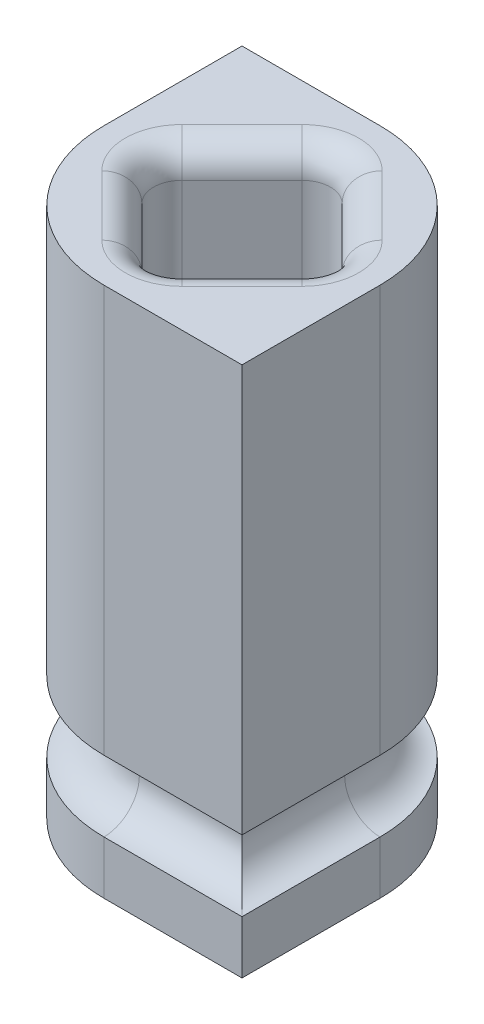
ISO-10303-21;
HEADER;
FILE_DESCRIPTION(('STEP AP214'),'2;1');
FILE_NAME('part.step','',(''),(''),'','','');
FILE_SCHEMA(('AUTOMOTIVE_DESIGN { 1 0 10303 214 1 1 1 1 }'));
ENDSEC;
DATA;
#1=APPLICATION_CONTEXT('core data for automotive mechanical design processes');
#2=APPLICATION_PROTOCOL_DEFINITION('international standard','automotive_design',2000,#1);
#3=PRODUCT_CONTEXT('',#1,'mechanical');
#4=PRODUCT('Part','Part','',(#3));
#5=PRODUCT_RELATED_PRODUCT_CATEGORY('part','',(#4));
#6=PRODUCT_DEFINITION_FORMATION('','',#4);
#7=PRODUCT_DEFINITION_CONTEXT('part definition',#1,'design');
#8=PRODUCT_DEFINITION('design','',#6,#7);
#9=PRODUCT_DEFINITION_SHAPE('','',#8);
#10=(LENGTH_UNIT() NAMED_UNIT(*) SI_UNIT(.MILLI.,.METRE.));
#11=(NAMED_UNIT(*) PLANE_ANGLE_UNIT() SI_UNIT($,.RADIAN.));
#12=(NAMED_UNIT(*) SI_UNIT($,.STERADIAN.) SOLID_ANGLE_UNIT());
#13=UNCERTAINTY_MEASURE_WITH_UNIT(LENGTH_MEASURE(1.E-05),#10,'distance_accuracy_value','');
#14=(GEOMETRIC_REPRESENTATION_CONTEXT(3) GLOBAL_UNCERTAINTY_ASSIGNED_CONTEXT((#13)) GLOBAL_UNIT_ASSIGNED_CONTEXT((#10,
#11,#12)) REPRESENTATION_CONTEXT('',''));
#15=CARTESIAN_POINT('',(0.,0.,0.));
#16=DIRECTION('',(0.,0.,1.));
#17=DIRECTION('',(1.,0.,0.));
#18=AXIS2_PLACEMENT_3D('',#15,#16,#17);
#19=CARTESIAN_POINT('',(3.9,5.,0.));
#20=DIRECTION('',(-1.,0.,0.));
#21=DIRECTION('',(0.,0.,1.));
#22=AXIS2_PLACEMENT_3D('',#19,#20,#21);
#23=PLANE('',#22);
#24=DIRECTION('',(0.,-1.,0.));
#25=VECTOR('',#24,1.);
#26=CARTESIAN_POINT('',(3.9,5.,3.9));
#27=LINE('',#26,#25);
#28=CARTESIAN_POINT('',(3.9,15.,3.9));
#29=VERTEX_POINT('',#28);
#30=CARTESIAN_POINT('',(3.9,3.5,3.9));
#31=VERTEX_POINT('',#30);
#32=EDGE_CURVE('E318',#29,#31,#27,.T.);
#33=ORIENTED_EDGE('',*,*,#32,.T.);
#34=DIRECTION('',(0.,0.,-1.));
#35=VECTOR('',#34,1.);
#36=CARTESIAN_POINT('',(3.9,3.5,0.));
#37=LINE('',#36,#35);
#38=CARTESIAN_POINT('',(3.9,3.5,0.));
#39=VERTEX_POINT('',#38);
#40=EDGE_CURVE('E290',#31,#39,#37,.T.);
#41=ORIENTED_EDGE('',*,*,#40,.T.);
#42=DIRECTION('',(0.,-1.,0.));
#43=VECTOR('',#42,1.);
#44=CARTESIAN_POINT('',(3.9,5.,0.));
#45=LINE('',#44,#43);
#46=CARTESIAN_POINT('',(3.9,15.,0.));
#47=VERTEX_POINT('',#46);
#48=EDGE_CURVE('E338',#47,#39,#45,.T.);
#49=ORIENTED_EDGE('',*,*,#48,.F.);
#50=DIRECTION('',(0.,0.,-1.));
#51=VECTOR('',#50,1.);
#52=CARTESIAN_POINT('',(3.9,15.,0.));
#53=LINE('',#52,#51);
#54=EDGE_CURVE('E263',#29,#47,#53,.T.);
#55=ORIENTED_EDGE('',*,*,#54,.F.);
#56=EDGE_LOOP('',(#33,#41,#49,#55));
#57=FACE_BOUND('',#56,.T.);
#58=ADVANCED_FACE('F33',(#57),#23,.F.);
#59=CARTESIAN_POINT('',(0.,5.,0.));
#60=DIRECTION('',(0.,-1.,0.));
#61=DIRECTION('',(0.,0.,-1.));
#62=AXIS2_PLACEMENT_3D('',#59,#60,#61);
#63=CYLINDRICAL_SURFACE('',#62,3.9);
#64=ORIENTED_EDGE('',*,*,#48,.T.);
#65=CARTESIAN_POINT('',(0.,3.5,0.));
#66=DIRECTION('',(0.,1.,0.));
#67=DIRECTION('',(0.,0.,1.));
#68=AXIS2_PLACEMENT_3D('',#65,#66,#67);
#69=CIRCLE('',#68,3.9);
#70=CARTESIAN_POINT('',(0.,3.5,-3.9));
#71=VERTEX_POINT('',#70);
#72=EDGE_CURVE('E293',#39,#71,#69,.T.);
#73=ORIENTED_EDGE('',*,*,#72,.T.);
#74=DIRECTION('',(0.,-1.,0.));
#75=VECTOR('',#74,1.);
#76=CARTESIAN_POINT('',(0.,5.,-3.9));
#77=LINE('',#76,#75);
#78=CARTESIAN_POINT('',(0.,15.,-3.9));
#79=VERTEX_POINT('',#78);
#80=EDGE_CURVE('E334',#79,#71,#77,.T.);
#81=ORIENTED_EDGE('',*,*,#80,.F.);
#82=CARTESIAN_POINT('',(0.,15.,0.));
#83=DIRECTION('',(0.,1.,0.));
#84=DIRECTION('',(0.,0.,1.));
#85=AXIS2_PLACEMENT_3D('',#82,#83,#84);
#86=CIRCLE('',#85,3.9);
#87=EDGE_CURVE('E248',#47,#79,#86,.T.);
#88=ORIENTED_EDGE('',*,*,#87,.F.);
#89=EDGE_LOOP('',(#64,#73,#81,#88));
#90=FACE_BOUND('',#89,.T.);
#91=ADVANCED_FACE('F519',(#90),#63,.T.);
#92=CARTESIAN_POINT('',(-3.9,5.,-3.9));
#93=DIRECTION('',(0.,0.,1.));
#94=DIRECTION('',(1.,0.,0.));
#95=AXIS2_PLACEMENT_3D('',#92,#93,#94);
#96=PLANE('',#95);
#97=ORIENTED_EDGE('',*,*,#80,.T.);
#98=DIRECTION('',(-1.,0.,0.));
#99=VECTOR('',#98,1.);
#100=CARTESIAN_POINT('',(-3.9,3.5,-3.9));
#101=LINE('',#100,#99);
#102=CARTESIAN_POINT('',(-3.9,3.5,-3.9));
#103=VERTEX_POINT('',#102);
#104=EDGE_CURVE('E295',#71,#103,#101,.T.);
#105=ORIENTED_EDGE('',*,*,#104,.T.);
#106=DIRECTION('',(0.,-1.,0.));
#107=VECTOR('',#106,1.);
#108=CARTESIAN_POINT('',(-3.9,5.,-3.9));
#109=LINE('',#108,#107);
#110=CARTESIAN_POINT('',(-3.9,15.,-3.9));
#111=VERTEX_POINT('',#110);
#112=EDGE_CURVE('E330',#111,#103,#109,.T.);
#113=ORIENTED_EDGE('',*,*,#112,.F.);
#114=DIRECTION('',(-1.,0.,0.));
#115=VECTOR('',#114,1.);
#116=CARTESIAN_POINT('',(0.,15.,-3.9));
#117=LINE('',#116,#115);
#118=EDGE_CURVE('E251',#79,#111,#117,.T.);
#119=ORIENTED_EDGE('',*,*,#118,.F.);
#120=EDGE_LOOP('',(#97,#105,#113,#119));
#121=FACE_BOUND('',#120,.T.);
#122=ADVANCED_FACE('F526',(#121),#96,.F.);
#123=CARTESIAN_POINT('',(-3.9,5.,-3.9));
#124=DIRECTION('',(1.,0.,0.));
#125=DIRECTION('',(0.,0.,-1.));
#126=AXIS2_PLACEMENT_3D('',#123,#124,#125);
#127=PLANE('',#126);
#128=ORIENTED_EDGE('',*,*,#112,.T.);
#129=DIRECTION('',(0.,0.,1.));
#130=VECTOR('',#129,1.);
#131=CARTESIAN_POINT('',(-3.9,3.5,0.));
#132=LINE('',#131,#130);
#133=CARTESIAN_POINT('',(-3.9,3.5,0.));
#134=VERTEX_POINT('',#133);
#135=EDGE_CURVE('E297',#103,#134,#132,.T.);
#136=ORIENTED_EDGE('',*,*,#135,.T.);
#137=DIRECTION('',(0.,-1.,0.));
#138=VECTOR('',#137,1.);
#139=CARTESIAN_POINT('',(-3.9,5.,0.));
#140=LINE('',#139,#138);
#141=CARTESIAN_POINT('',(-3.9,15.,0.));
#142=VERTEX_POINT('',#141);
#143=EDGE_CURVE('E326',#142,#134,#140,.T.);
#144=ORIENTED_EDGE('',*,*,#143,.F.);
#145=DIRECTION('',(0.,0.,1.));
#146=VECTOR('',#145,1.);
#147=CARTESIAN_POINT('',(-3.9,15.,-3.9));
#148=LINE('',#147,#146);
#149=EDGE_CURVE('E254',#111,#142,#148,.T.);
#150=ORIENTED_EDGE('',*,*,#149,.F.);
#151=EDGE_LOOP('',(#128,#136,#144,#150));
#152=FACE_BOUND('',#151,.T.);
#153=ADVANCED_FACE('F607',(#152),#127,.F.);
#154=CARTESIAN_POINT('',(0.,5.,0.));
#155=DIRECTION('',(0.,-1.,0.));
#156=DIRECTION('',(0.,0.,-1.));
#157=AXIS2_PLACEMENT_3D('',#154,#155,#156);
#158=CYLINDRICAL_SURFACE('',#157,3.9);
#159=ORIENTED_EDGE('',*,*,#143,.T.);
#160=CARTESIAN_POINT('',(0.,3.5,0.));
#161=DIRECTION('',(0.,1.,0.));
#162=DIRECTION('',(0.,0.,1.));
#163=AXIS2_PLACEMENT_3D('',#160,#161,#162);
#164=CIRCLE('',#163,3.9);
#165=CARTESIAN_POINT('',(0.,3.5,3.9));
#166=VERTEX_POINT('',#165);
#167=EDGE_CURVE('E286',#134,#166,#164,.T.);
#168=ORIENTED_EDGE('',*,*,#167,.T.);
#169=DIRECTION('',(0.,-1.,0.));
#170=VECTOR('',#169,1.);
#171=CARTESIAN_POINT('',(0.,5.,3.9));
#172=LINE('',#171,#170);
#173=CARTESIAN_POINT('',(0.,15.,3.9));
#174=VERTEX_POINT('',#173);
#175=EDGE_CURVE('E322',#174,#166,#172,.T.);
#176=ORIENTED_EDGE('',*,*,#175,.F.);
#177=CARTESIAN_POINT('',(0.,15.,0.));
#178=DIRECTION('',(0.,1.,0.));
#179=DIRECTION('',(0.,0.,1.));
#180=AXIS2_PLACEMENT_3D('',#177,#178,#179);
#181=CIRCLE('',#180,3.9);
#182=EDGE_CURVE('E257',#142,#174,#181,.T.);
#183=ORIENTED_EDGE('',*,*,#182,.F.);
#184=EDGE_LOOP('',(#159,#168,#176,#183));
#185=FACE_BOUND('',#184,.T.);
#186=ADVANCED_FACE('F601',(#185),#158,.T.);
#187=CARTESIAN_POINT('',(0.,5.,3.9));
#188=DIRECTION('',(0.,0.,-1.));
#189=DIRECTION('',(-1.,0.,0.));
#190=AXIS2_PLACEMENT_3D('',#187,#188,#189);
#191=PLANE('',#190);
#192=ORIENTED_EDGE('',*,*,#175,.T.);
#193=DIRECTION('',(1.,0.,0.));
#194=VECTOR('',#193,1.);
#195=CARTESIAN_POINT('',(3.9,3.5,3.9));
#196=LINE('',#195,#194);
#197=EDGE_CURVE('E288',#166,#31,#196,.T.);
#198=ORIENTED_EDGE('',*,*,#197,.T.);
#199=ORIENTED_EDGE('',*,*,#32,.F.);
#200=DIRECTION('',(1.,0.,0.));
#201=VECTOR('',#200,1.);
#202=CARTESIAN_POINT('',(3.9,15.,3.9));
#203=LINE('',#202,#201);
#204=EDGE_CURVE('E260',#174,#29,#203,.T.);
#205=ORIENTED_EDGE('',*,*,#204,.F.);
#206=EDGE_LOOP('',(#192,#198,#199,#205));
#207=FACE_BOUND('',#206,.T.);
#208=ADVANCED_FACE('F609',(#207),#191,.F.);
#209=CARTESIAN_POINT('',(0.,0.,0.));
#210=DIRECTION('',(0.,1.,0.));
#211=DIRECTION('',(0.,0.,1.));
#212=AXIS2_PLACEMENT_3D('',#209,#210,#211);
#213=PLANE('',#212);
#214=DIRECTION('',(0.,0.,-1.));
#215=VECTOR('',#214,1.);
#216=CARTESIAN_POINT('',(3.9,0.,0.));
#217=LINE('',#216,#215);
#218=CARTESIAN_POINT('',(3.9,0.,3.9));
#219=VERTEX_POINT('',#218);
#220=CARTESIAN_POINT('',(3.9,0.,0.));
#221=VERTEX_POINT('',#220);
#222=EDGE_CURVE('E299',#219,#221,#217,.T.);
#223=ORIENTED_EDGE('',*,*,#222,.F.);
#224=DIRECTION('',(1.,0.,0.));
#225=VECTOR('',#224,1.);
#226=CARTESIAN_POINT('',(0.,0.,3.9));
#227=LINE('',#226,#225);
#228=CARTESIAN_POINT('',(0.,0.,3.9));
#229=VERTEX_POINT('',#228);
#230=EDGE_CURVE('E314',#229,#219,#227,.T.);
#231=ORIENTED_EDGE('',*,*,#230,.F.);
#232=CARTESIAN_POINT('',(0.,0.,0.));
#233=DIRECTION('',(0.,1.,0.));
#234=DIRECTION('',(0.,0.,1.));
#235=AXIS2_PLACEMENT_3D('',#232,#233,#234);
#236=CIRCLE('',#235,3.9);
#237=CARTESIAN_POINT('',(-3.9,0.,0.));
#238=VERTEX_POINT('',#237);
#239=EDGE_CURVE('E311',#238,#229,#236,.T.);
#240=ORIENTED_EDGE('',*,*,#239,.F.);
#241=DIRECTION('',(0.,0.,1.));
#242=VECTOR('',#241,1.);
#243=CARTESIAN_POINT('',(-3.9,0.,-3.9));
#244=LINE('',#243,#242);
#245=CARTESIAN_POINT('',(-3.9,0.,-3.9));
#246=VERTEX_POINT('',#245);
#247=EDGE_CURVE('E308',#246,#238,#244,.T.);
#248=ORIENTED_EDGE('',*,*,#247,.F.);
#249=DIRECTION('',(-1.,0.,0.));
#250=VECTOR('',#249,1.);
#251=CARTESIAN_POINT('',(-3.9,0.,-3.9));
#252=LINE('',#251,#250);
#253=CARTESIAN_POINT('',(0.,0.,-3.9));
#254=VERTEX_POINT('',#253);
#255=EDGE_CURVE('E305',#254,#246,#252,.T.);
#256=ORIENTED_EDGE('',*,*,#255,.F.);
#257=CARTESIAN_POINT('',(0.,0.,0.));
#258=DIRECTION('',(0.,1.,0.));
#259=DIRECTION('',(0.,0.,1.));
#260=AXIS2_PLACEMENT_3D('',#257,#258,#259);
#261=CIRCLE('',#260,3.9);
#262=EDGE_CURVE('E302',#221,#254,#261,.T.);
#263=ORIENTED_EDGE('',*,*,#262,.F.);
#264=EDGE_LOOP('',(#223,#231,#240,#248,#256,#263));
#265=FACE_BOUND('',#264,.T.);
#266=ADVANCED_FACE('F556',(#265),#213,.F.);
#267=DIRECTION('',(1.,0.,0.));
#268=VECTOR('',#267,1.);
#269=CARTESIAN_POINT('',(3.9,1.5,3.9));
#270=LINE('',#269,#268);
#271=CARTESIAN_POINT('',(0.,1.5,3.9));
#272=VERTEX_POINT('',#271);
#273=CARTESIAN_POINT('',(3.9,1.5,3.9));
#274=VERTEX_POINT('',#273);
#275=EDGE_CURVE('E270',#272,#274,#270,.T.);
#276=ORIENTED_EDGE('',*,*,#275,.F.);
#277=EDGE_CURVE('E321',#272,#229,#172,.T.);
#278=ORIENTED_EDGE('',*,*,#277,.T.);
#279=ORIENTED_EDGE('',*,*,#230,.T.);
#280=EDGE_CURVE('E317',#274,#219,#27,.T.);
#281=ORIENTED_EDGE('',*,*,#280,.F.);
#282=EDGE_LOOP('',(#276,#278,#279,#281));
#283=FACE_BOUND('',#282,.T.);
#284=ADVANCED_FACE('F549',(#283),#191,.F.);
#285=CARTESIAN_POINT('',(0.,1.5,0.));
#286=DIRECTION('',(0.,1.,0.));
#287=DIRECTION('',(0.,0.,1.));
#288=AXIS2_PLACEMENT_3D('',#285,#286,#287);
#289=CIRCLE('',#288,3.9);
#290=CARTESIAN_POINT('',(-3.9,1.5,0.));
#291=VERTEX_POINT('',#290);
#292=EDGE_CURVE('E267',#291,#272,#289,.T.);
#293=ORIENTED_EDGE('',*,*,#292,.F.);
#294=EDGE_CURVE('E325',#291,#238,#140,.T.);
#295=ORIENTED_EDGE('',*,*,#294,.T.);
#296=ORIENTED_EDGE('',*,*,#239,.T.);
#297=ORIENTED_EDGE('',*,*,#277,.F.);
#298=EDGE_LOOP('',(#293,#295,#296,#297));
#299=FACE_BOUND('',#298,.T.);
#300=ADVANCED_FACE('F598',(#299),#158,.T.);
#301=DIRECTION('',(0.,0.,1.));
#302=VECTOR('',#301,1.);
#303=CARTESIAN_POINT('',(-3.9,1.5,0.));
#304=LINE('',#303,#302);
#305=CARTESIAN_POINT('',(-3.9,1.5,-3.9));
#306=VERTEX_POINT('',#305);
#307=EDGE_CURVE('E283',#306,#291,#304,.T.);
#308=ORIENTED_EDGE('',*,*,#307,.F.);
#309=EDGE_CURVE('E329',#306,#246,#109,.T.);
#310=ORIENTED_EDGE('',*,*,#309,.T.);
#311=ORIENTED_EDGE('',*,*,#247,.T.);
#312=ORIENTED_EDGE('',*,*,#294,.F.);
#313=EDGE_LOOP('',(#308,#310,#311,#312));
#314=FACE_BOUND('',#313,.T.);
#315=ADVANCED_FACE('F595',(#314),#127,.F.);
#316=DIRECTION('',(-1.,0.,0.));
#317=VECTOR('',#316,1.);
#318=CARTESIAN_POINT('',(-3.9,1.5,-3.9));
#319=LINE('',#318,#317);
#320=CARTESIAN_POINT('',(0.,1.5,-3.9));
#321=VERTEX_POINT('',#320);
#322=EDGE_CURVE('E280',#321,#306,#319,.T.);
#323=ORIENTED_EDGE('',*,*,#322,.F.);
#324=EDGE_CURVE('E333',#321,#254,#77,.T.);
#325=ORIENTED_EDGE('',*,*,#324,.T.);
#326=ORIENTED_EDGE('',*,*,#255,.T.);
#327=ORIENTED_EDGE('',*,*,#309,.F.);
#328=EDGE_LOOP('',(#323,#325,#326,#327));
#329=FACE_BOUND('',#328,.T.);
#330=ADVANCED_FACE('F541',(#329),#96,.F.);
#331=CARTESIAN_POINT('',(0.,1.5,0.));
#332=DIRECTION('',(0.,1.,0.));
#333=DIRECTION('',(0.,0.,1.));
#334=AXIS2_PLACEMENT_3D('',#331,#332,#333);
#335=CIRCLE('',#334,3.9);
#336=CARTESIAN_POINT('',(3.9,1.5,0.));
#337=VERTEX_POINT('',#336);
#338=EDGE_CURVE('E277',#337,#321,#335,.T.);
#339=ORIENTED_EDGE('',*,*,#338,.F.);
#340=EDGE_CURVE('E337',#337,#221,#45,.T.);
#341=ORIENTED_EDGE('',*,*,#340,.T.);
#342=ORIENTED_EDGE('',*,*,#262,.T.);
#343=ORIENTED_EDGE('',*,*,#324,.F.);
#344=EDGE_LOOP('',(#339,#341,#342,#343));
#345=FACE_BOUND('',#344,.T.);
#346=ADVANCED_FACE('F529',(#345),#63,.T.);
#347=DIRECTION('',(0.,0.,-1.));
#348=VECTOR('',#347,1.);
#349=CARTESIAN_POINT('',(3.9,1.5,0.));
#350=LINE('',#349,#348);
#351=EDGE_CURVE('E274',#274,#337,#350,.T.);
#352=ORIENTED_EDGE('',*,*,#351,.F.);
#353=ORIENTED_EDGE('',*,*,#280,.T.);
#354=ORIENTED_EDGE('',*,*,#222,.T.);
#355=ORIENTED_EDGE('',*,*,#340,.F.);
#356=EDGE_LOOP('',(#352,#353,#354,#355));
#357=FACE_BOUND('',#356,.T.);
#358=ADVANCED_FACE('F522',(#357),#23,.F.);
#359=CARTESIAN_POINT('',(-3.9,2.5,0.));
#360=DIRECTION('',(0.,0.,1.));
#361=DIRECTION('',(1.,0.,0.));
#362=AXIS2_PLACEMENT_3D('',#359,#360,#361);
#363=CYLINDRICAL_SURFACE('',#362,1.);
#364=CARTESIAN_POINT('',(-3.9,2.5,-3.9));
#365=DIRECTION('',(-0.707106781186547,0.,0.707106781186547));
#366=DIRECTION('',(-0.707106781186547,0.,-0.707106781186547));
#367=AXIS2_PLACEMENT_3D('',#364,#365,#366);
#368=ELLIPSE('',#367,1.41421356237309,1.);
#369=CARTESIAN_POINT('',(-2.9,2.5,-2.9));
#370=VERTEX_POINT('',#369);
#371=EDGE_CURVE('E383',#306,#370,#368,.T.);
#372=ORIENTED_EDGE('',*,*,#371,.F.);
#373=ORIENTED_EDGE('',*,*,#307,.T.);
#374=CARTESIAN_POINT('',(-3.9,2.5,0.));
#375=DIRECTION('',(0.,0.,-1.));
#376=DIRECTION('',(-1.,0.,0.));
#377=AXIS2_PLACEMENT_3D('',#374,#375,#376);
#378=CIRCLE('',#377,1.);
#379=CARTESIAN_POINT('',(-2.9,2.5,0.));
#380=VERTEX_POINT('',#379);
#381=EDGE_CURVE('E271',#380,#291,#378,.T.);
#382=ORIENTED_EDGE('',*,*,#381,.F.);
#383=DIRECTION('',(0.,0.,1.));
#384=VECTOR('',#383,1.);
#385=CARTESIAN_POINT('',(-2.9,2.5,0.));
#386=LINE('',#385,#384);
#387=EDGE_CURVE('E386',#370,#380,#386,.T.);
#388=ORIENTED_EDGE('',*,*,#387,.F.);
#389=EDGE_LOOP('',(#372,#373,#382,#388));
#390=FACE_BOUND('',#389,.T.);
#391=ADVANCED_FACE('F532',(#390),#363,.F.);
#392=CARTESIAN_POINT('',(0.,2.5,0.));
#393=DIRECTION('',(0.,1.,0.));
#394=DIRECTION('',(0.,0.,1.));
#395=AXIS2_PLACEMENT_3D('',#392,#393,#394);
#396=TOROIDAL_SURFACE('',#395,3.9,1.);
#397=ORIENTED_EDGE('',*,*,#381,.T.);
#398=ORIENTED_EDGE('',*,*,#292,.T.);
#399=CARTESIAN_POINT('',(0.,2.5,3.9));
#400=DIRECTION('',(-1.,0.,0.));
#401=DIRECTION('',(0.,0.,1.));
#402=AXIS2_PLACEMENT_3D('',#399,#400,#401);
#403=CIRCLE('',#402,1.);
#404=CARTESIAN_POINT('',(0.,2.5,2.9));
#405=VERTEX_POINT('',#404);
#406=EDGE_CURVE('E380',#405,#272,#403,.T.);
#407=ORIENTED_EDGE('',*,*,#406,.F.);
#408=CARTESIAN_POINT('',(0.,2.5,0.));
#409=DIRECTION('',(0.,1.,0.));
#410=DIRECTION('',(0.,0.,1.));
#411=AXIS2_PLACEMENT_3D('',#408,#409,#410);
#412=CIRCLE('',#411,2.9);
#413=EDGE_CURVE('E377',#380,#405,#412,.T.);
#414=ORIENTED_EDGE('',*,*,#413,.F.);
#415=EDGE_LOOP('',(#397,#398,#407,#414));
#416=FACE_BOUND('',#415,.T.);
#417=ADVANCED_FACE('F538',(#416),#396,.F.);
#418=CARTESIAN_POINT('',(-3.9,2.5,0.));
#419=DIRECTION('',(0.,0.,-1.));
#420=DIRECTION('',(-1.,0.,0.));
#421=AXIS2_PLACEMENT_3D('',#418,#419,#420);
#422=CYLINDRICAL_SURFACE('',#421,1.);
#423=CARTESIAN_POINT('',(-3.9,2.5,-3.9));
#424=DIRECTION('',(0.707106781186547,0.,-0.707106781186547));
#425=DIRECTION('',(-0.707106781186547,0.,-0.707106781186547));
#426=AXIS2_PLACEMENT_3D('',#423,#424,#425);
#427=ELLIPSE('',#426,1.41421356237309,1.);
#428=EDGE_CURVE('E371',#370,#103,#427,.F.);
#429=ORIENTED_EDGE('',*,*,#428,.F.);
#430=ORIENTED_EDGE('',*,*,#387,.T.);
#431=CARTESIAN_POINT('',(-3.9,2.5,0.));
#432=DIRECTION('',(0.,0.,-1.));
#433=DIRECTION('',(-1.,0.,0.));
#434=AXIS2_PLACEMENT_3D('',#431,#432,#433);
#435=CIRCLE('',#434,1.);
#436=EDGE_CURVE('E374',#134,#380,#435,.T.);
#437=ORIENTED_EDGE('',*,*,#436,.F.);
#438=ORIENTED_EDGE('',*,*,#135,.F.);
#439=EDGE_LOOP('',(#429,#430,#437,#438));
#440=FACE_BOUND('',#439,.T.);
#441=ADVANCED_FACE('F588',(#440),#422,.F.);
#442=CARTESIAN_POINT('',(-2.9,2.5,-3.9));
#443=DIRECTION('',(-1.,0.,0.));
#444=DIRECTION('',(0.,0.,1.));
#445=AXIS2_PLACEMENT_3D('',#442,#443,#444);
#446=CYLINDRICAL_SURFACE('',#445,1.);
#447=ORIENTED_EDGE('',*,*,#322,.T.);
#448=ORIENTED_EDGE('',*,*,#371,.T.);
#449=DIRECTION('',(-1.,0.,0.));
#450=VECTOR('',#449,1.);
#451=CARTESIAN_POINT('',(-2.9,2.5,-2.9));
#452=LINE('',#451,#450);
#453=CARTESIAN_POINT('',(0.,2.5,-2.9));
#454=VERTEX_POINT('',#453);
#455=EDGE_CURVE('E368',#454,#370,#452,.T.);
#456=ORIENTED_EDGE('',*,*,#455,.F.);
#457=CARTESIAN_POINT('',(0.,2.5,-3.9));
#458=DIRECTION('',(-1.,0.,0.));
#459=DIRECTION('',(0.,0.,1.));
#460=AXIS2_PLACEMENT_3D('',#457,#458,#459);
#461=CIRCLE('',#460,1.);
#462=EDGE_CURVE('E365',#321,#454,#461,.T.);
#463=ORIENTED_EDGE('',*,*,#462,.F.);
#464=EDGE_LOOP('',(#447,#448,#456,#463));
#465=FACE_BOUND('',#464,.T.);
#466=ADVANCED_FACE('F591',(#465),#446,.F.);
#467=CARTESIAN_POINT('',(2.9,2.5,3.9));
#468=DIRECTION('',(1.,0.,0.));
#469=DIRECTION('',(0.,0.,-1.));
#470=AXIS2_PLACEMENT_3D('',#467,#468,#469);
#471=CYLINDRICAL_SURFACE('',#470,1.);
#472=ORIENTED_EDGE('',*,*,#406,.T.);
#473=ORIENTED_EDGE('',*,*,#275,.T.);
#474=CARTESIAN_POINT('',(3.9,2.5,3.9));
#475=DIRECTION('',(0.707106781186547,0.,-0.707106781186547));
#476=DIRECTION('',(0.707106781186547,0.,0.707106781186547));
#477=AXIS2_PLACEMENT_3D('',#474,#475,#476);
#478=ELLIPSE('',#477,1.41421356237309,1.);
#479=CARTESIAN_POINT('',(2.9,2.5,2.9));
#480=VERTEX_POINT('',#479);
#481=EDGE_CURVE('E361',#480,#274,#478,.F.);
#482=ORIENTED_EDGE('',*,*,#481,.F.);
#483=DIRECTION('',(1.,0.,0.));
#484=VECTOR('',#483,1.);
#485=CARTESIAN_POINT('',(2.9,2.5,2.9));
#486=LINE('',#485,#484);
#487=EDGE_CURVE('E358',#405,#480,#486,.T.);
#488=ORIENTED_EDGE('',*,*,#487,.F.);
#489=EDGE_LOOP('',(#472,#473,#482,#488));
#490=FACE_BOUND('',#489,.T.);
#491=ADVANCED_FACE('F578',(#490),#471,.F.);
#492=CARTESIAN_POINT('',(0.,2.5,0.));
#493=DIRECTION('',(0.,1.,0.));
#494=DIRECTION('',(0.,0.,1.));
#495=AXIS2_PLACEMENT_3D('',#492,#493,#494);
#496=TOROIDAL_SURFACE('',#495,3.9,1.);
#497=ORIENTED_EDGE('',*,*,#436,.T.);
#498=ORIENTED_EDGE('',*,*,#413,.T.);
#499=CARTESIAN_POINT('',(0.,2.5,3.9));
#500=DIRECTION('',(-1.,0.,0.));
#501=DIRECTION('',(0.,0.,1.));
#502=AXIS2_PLACEMENT_3D('',#499,#500,#501);
#503=CIRCLE('',#502,1.);
#504=EDGE_CURVE('E355',#166,#405,#503,.T.);
#505=ORIENTED_EDGE('',*,*,#504,.F.);
#506=ORIENTED_EDGE('',*,*,#167,.F.);
#507=EDGE_LOOP('',(#497,#498,#505,#506));
#508=FACE_BOUND('',#507,.T.);
#509=ADVANCED_FACE('F582',(#508),#496,.F.);
#510=CARTESIAN_POINT('',(0.,2.5,-3.9));
#511=DIRECTION('',(1.,0.,0.));
#512=DIRECTION('',(0.,0.,-1.));
#513=AXIS2_PLACEMENT_3D('',#510,#511,#512);
#514=CYLINDRICAL_SURFACE('',#513,1.);
#515=ORIENTED_EDGE('',*,*,#428,.T.);
#516=ORIENTED_EDGE('',*,*,#104,.F.);
#517=CARTESIAN_POINT('',(0.,2.5,-3.9));
#518=DIRECTION('',(-1.,0.,0.));
#519=DIRECTION('',(0.,0.,1.));
#520=AXIS2_PLACEMENT_3D('',#517,#518,#519);
#521=CIRCLE('',#520,1.);
#522=EDGE_CURVE('E352',#454,#71,#521,.T.);
#523=ORIENTED_EDGE('',*,*,#522,.F.);
#524=ORIENTED_EDGE('',*,*,#455,.T.);
#525=EDGE_LOOP('',(#515,#516,#523,#524));
#526=FACE_BOUND('',#525,.T.);
#527=ADVANCED_FACE('F626',(#526),#514,.F.);
#528=CARTESIAN_POINT('',(0.,2.5,0.));
#529=DIRECTION('',(0.,1.,0.));
#530=DIRECTION('',(0.,0.,1.));
#531=AXIS2_PLACEMENT_3D('',#528,#529,#530);
#532=TOROIDAL_SURFACE('',#531,3.9,1.);
#533=CARTESIAN_POINT('',(3.9,2.5,0.));
#534=DIRECTION('',(0.,0.,-1.));
#535=DIRECTION('',(-1.,0.,0.));
#536=AXIS2_PLACEMENT_3D('',#533,#534,#535);
#537=CIRCLE('',#536,1.);
#538=CARTESIAN_POINT('',(2.9,2.5,0.));
#539=VERTEX_POINT('',#538);
#540=EDGE_CURVE('E363',#337,#539,#537,.T.);
#541=ORIENTED_EDGE('',*,*,#540,.F.);
#542=ORIENTED_EDGE('',*,*,#338,.T.);
#543=ORIENTED_EDGE('',*,*,#462,.T.);
#544=CARTESIAN_POINT('',(0.,2.5,0.));
#545=DIRECTION('',(0.,1.,0.));
#546=DIRECTION('',(0.,0.,1.));
#547=AXIS2_PLACEMENT_3D('',#544,#545,#546);
#548=CIRCLE('',#547,2.9);
#549=EDGE_CURVE('E349',#539,#454,#548,.T.);
#550=ORIENTED_EDGE('',*,*,#549,.F.);
#551=EDGE_LOOP('',(#541,#542,#543,#550));
#552=FACE_BOUND('',#551,.T.);
#553=ADVANCED_FACE('F562',(#552),#532,.F.);
#554=CARTESIAN_POINT('',(3.9,2.5,0.));
#555=DIRECTION('',(0.,0.,-1.));
#556=DIRECTION('',(-1.,0.,0.));
#557=AXIS2_PLACEMENT_3D('',#554,#555,#556);
#558=CYLINDRICAL_SURFACE('',#557,1.);
#559=ORIENTED_EDGE('',*,*,#351,.T.);
#560=ORIENTED_EDGE('',*,*,#540,.T.);
#561=DIRECTION('',(0.,0.,-1.));
#562=VECTOR('',#561,1.);
#563=CARTESIAN_POINT('',(2.9,2.5,0.));
#564=LINE('',#563,#562);
#565=EDGE_CURVE('E346',#480,#539,#564,.T.);
#566=ORIENTED_EDGE('',*,*,#565,.F.);
#567=ORIENTED_EDGE('',*,*,#481,.T.);
#568=EDGE_LOOP('',(#559,#560,#566,#567));
#569=FACE_BOUND('',#568,.T.);
#570=ADVANCED_FACE('F566',(#569),#558,.F.);
#571=CARTESIAN_POINT('',(0.,2.5,3.9));
#572=DIRECTION('',(-1.,0.,0.));
#573=DIRECTION('',(0.,0.,1.));
#574=AXIS2_PLACEMENT_3D('',#571,#572,#573);
#575=CYLINDRICAL_SURFACE('',#574,1.);
#576=ORIENTED_EDGE('',*,*,#504,.T.);
#577=ORIENTED_EDGE('',*,*,#487,.T.);
#578=CARTESIAN_POINT('',(3.9,2.5,3.9));
#579=DIRECTION('',(-0.707106781186547,0.,0.707106781186547));
#580=DIRECTION('',(-0.707106781186547,0.,-0.707106781186547));
#581=AXIS2_PLACEMENT_3D('',#578,#579,#580);
#582=ELLIPSE('',#581,1.41421356237309,1.);
#583=EDGE_CURVE('E343',#31,#480,#582,.T.);
#584=ORIENTED_EDGE('',*,*,#583,.F.);
#585=ORIENTED_EDGE('',*,*,#197,.F.);
#586=EDGE_LOOP('',(#576,#577,#584,#585));
#587=FACE_BOUND('',#586,.T.);
#588=ADVANCED_FACE('F574',(#587),#575,.F.);
#589=CARTESIAN_POINT('',(0.,2.5,0.));
#590=DIRECTION('',(0.,1.,0.));
#591=DIRECTION('',(0.,0.,1.));
#592=AXIS2_PLACEMENT_3D('',#589,#590,#591);
#593=TOROIDAL_SURFACE('',#592,3.9,1.);
#594=ORIENTED_EDGE('',*,*,#522,.T.);
#595=ORIENTED_EDGE('',*,*,#72,.F.);
#596=CARTESIAN_POINT('',(3.9,2.5,0.));
#597=DIRECTION('',(0.,0.,-1.));
#598=DIRECTION('',(0.,1.,0.));
#599=AXIS2_PLACEMENT_3D('',#596,#597,#598);
#600=CIRCLE('',#599,1.);
#601=EDGE_CURVE('E266',#539,#39,#600,.T.);
#602=ORIENTED_EDGE('',*,*,#601,.F.);
#603=ORIENTED_EDGE('',*,*,#549,.T.);
#604=EDGE_LOOP('',(#594,#595,#602,#603));
#605=FACE_BOUND('',#604,.T.);
#606=ADVANCED_FACE('F629',(#605),#593,.F.);
#607=CARTESIAN_POINT('',(3.9,2.5,0.));
#608=DIRECTION('',(0.,0.,1.));
#609=DIRECTION('',(1.,0.,0.));
#610=AXIS2_PLACEMENT_3D('',#607,#608,#609);
#611=CYLINDRICAL_SURFACE('',#610,1.);
#612=ORIENTED_EDGE('',*,*,#583,.T.);
#613=ORIENTED_EDGE('',*,*,#565,.T.);
#614=ORIENTED_EDGE('',*,*,#601,.T.);
#615=ORIENTED_EDGE('',*,*,#40,.F.);
#616=EDGE_LOOP('',(#612,#613,#614,#615));
#617=FACE_BOUND('',#616,.T.);
#618=ADVANCED_FACE('F571',(#617),#611,.F.);
#619=CARTESIAN_POINT('',(0.,15.,0.));
#620=DIRECTION('',(0.,1.,0.));
#621=DIRECTION('',(0.,0.,1.));
#622=AXIS2_PLACEMENT_3D('',#619,#620,#621);
#623=PLANE('',#622);
#624=DIRECTION('',(-0.707106781186551,0.,0.707106781186544));
#625=VECTOR('',#624,1.);
#626=CARTESIAN_POINT('',(-1.97989898732235,15.,-1.97989898732238));
#627=LINE('',#626,#625);
#628=CARTESIAN_POINT('',(-2.82842712474621,15.,-1.13137084989852));
#629=VERTEX_POINT('',#628);
#630=CARTESIAN_POINT('',(-1.13137084989849,15.,-2.82842712474623));
#631=VERTEX_POINT('',#630);
#632=EDGE_CURVE('E393',#629,#631,#627,.F.);
#633=ORIENTED_EDGE('',*,*,#632,.T.);
#634=CARTESIAN_POINT('',(0.,15.,-1.69705627484775));
#635=DIRECTION('',(0.,1.,0.));
#636=DIRECTION('',(0.,0.,1.));
#637=AXIS2_PLACEMENT_3D('',#634,#635,#636);
#638=CIRCLE('',#637,1.6);
#639=CARTESIAN_POINT('',(1.13137084989846,15.,-2.82842712474621));
#640=VERTEX_POINT('',#639);
#641=EDGE_CURVE('E407',#631,#640,#638,.F.);
#642=ORIENTED_EDGE('',*,*,#641,.T.);
#643=DIRECTION('',(-0.707106781186544,0.,-0.707106781186551));
#644=VECTOR('',#643,1.);
#645=CARTESIAN_POINT('',(1.97989898732234,15.,-1.97989898732232));
#646=LINE('',#645,#644);
#647=CARTESIAN_POINT('',(2.82842712474622,15.,-1.13137084989844));
#648=VERTEX_POINT('',#647);
#649=EDGE_CURVE('E405',#640,#648,#646,.F.);
#650=ORIENTED_EDGE('',*,*,#649,.T.);
#651=CARTESIAN_POINT('',(1.69705627484774,15.,0.));
#652=DIRECTION('',(0.,1.,0.));
#653=DIRECTION('',(0.,0.,1.));
#654=AXIS2_PLACEMENT_3D('',#651,#652,#653);
#655=CIRCLE('',#654,1.6);
#656=CARTESIAN_POINT('',(2.8284271247462,15.,1.13137084989851));
#657=VERTEX_POINT('',#656);
#658=EDGE_CURVE('E403',#648,#657,#655,.F.);
#659=ORIENTED_EDGE('',*,*,#658,.T.);
#660=DIRECTION('',(0.707106781186551,0.,-0.707106781186544));
#661=VECTOR('',#660,1.);
#662=CARTESIAN_POINT('',(1.97989898732234,15.,1.97989898732236));
#663=LINE('',#662,#661);
#664=CARTESIAN_POINT('',(1.13137084989848,15.,2.82842712474622));
#665=VERTEX_POINT('',#664);
#666=EDGE_CURVE('E401',#657,#665,#663,.F.);
#667=ORIENTED_EDGE('',*,*,#666,.T.);
#668=CARTESIAN_POINT('',(0.,15.,1.69705627484774));
#669=DIRECTION('',(0.,1.,0.));
#670=DIRECTION('',(0.,0.,1.));
#671=AXIS2_PLACEMENT_3D('',#668,#669,#670);
#672=CIRCLE('',#671,1.6);
#673=CARTESIAN_POINT('',(-1.13137084989848,15.,2.8284271247462));
#674=VERTEX_POINT('',#673);
#675=EDGE_CURVE('E399',#665,#674,#672,.F.);
#676=ORIENTED_EDGE('',*,*,#675,.T.);
#677=DIRECTION('',(0.707106781186544,0.,0.707106781186551));
#678=VECTOR('',#677,1.);
#679=CARTESIAN_POINT('',(-1.97989898732234,15.,1.97989898732232));
#680=LINE('',#679,#678);
#681=CARTESIAN_POINT('',(-2.82842712474622,15.,1.13137084989843));
#682=VERTEX_POINT('',#681);
#683=EDGE_CURVE('E397',#674,#682,#680,.F.);
#684=ORIENTED_EDGE('',*,*,#683,.T.);
#685=CARTESIAN_POINT('',(-1.69705627484775,15.,0.));
#686=DIRECTION('',(0.,1.,0.));
#687=DIRECTION('',(0.,0.,1.));
#688=AXIS2_PLACEMENT_3D('',#685,#686,#687);
#689=CIRCLE('',#688,1.59999999999999);
#690=EDGE_CURVE('E395',#682,#629,#689,.F.);
#691=ORIENTED_EDGE('',*,*,#690,.T.);
#692=EDGE_LOOP('',(#633,#642,#650,#659,#667,#676,#684,#691));
#693=FACE_BOUND('',#692,.T.);
#694=ORIENTED_EDGE('',*,*,#87,.T.);
#695=ORIENTED_EDGE('',*,*,#118,.T.);
#696=ORIENTED_EDGE('',*,*,#149,.T.);
#697=ORIENTED_EDGE('',*,*,#182,.T.);
#698=ORIENTED_EDGE('',*,*,#204,.T.);
#699=ORIENTED_EDGE('',*,*,#54,.T.);
#700=EDGE_LOOP('',(#694,#695,#696,#697,#698,#699));
#701=FACE_BOUND('',#700,.T.);
#702=ADVANCED_FACE('F476',(#693,#701),#623,.T.);
#703=CARTESIAN_POINT('',(0.,15.,1.69705627484774));
#704=DIRECTION('',(0.,-1.,0.));
#705=DIRECTION('',(0.,0.,-1.));
#706=AXIS2_PLACEMENT_3D('',#703,#704,#705);
#707=CYLINDRICAL_SURFACE('',#706,0.799999999999996);
#708=DIRECTION('',(0.,-1.,0.));
#709=VECTOR('',#708,1.);
#710=CARTESIAN_POINT('',(-0.56568542494923,15.,2.26274169979697));
#711=LINE('',#710,#709);
#712=CARTESIAN_POINT('',(-0.56568542494923,14.2,2.26274169979697));
#713=VERTEX_POINT('',#712);
#714=CARTESIAN_POINT('',(-0.56568542494923,5.,2.26274169979697));
#715=VERTEX_POINT('',#714);
#716=EDGE_CURVE('E218',#713,#715,#711,.T.);
#717=ORIENTED_EDGE('',*,*,#716,.F.);
#718=CARTESIAN_POINT('',(0.,14.2,1.69705627484774));
#719=DIRECTION('',(0.,1.,0.));
#720=DIRECTION('',(0.,0.,1.));
#721=AXIS2_PLACEMENT_3D('',#718,#719,#720);
#722=CIRCLE('',#721,0.799999999999996);
#723=CARTESIAN_POINT('',(0.565685424949246,14.2,2.26274169979698));
#724=VERTEX_POINT('',#723);
#725=EDGE_CURVE('E416',#713,#724,#722,.T.);
#726=ORIENTED_EDGE('',*,*,#725,.T.);
#727=DIRECTION('',(0.,-1.,0.));
#728=VECTOR('',#727,1.);
#729=CARTESIAN_POINT('',(0.565685424949246,15.,2.26274169979698));
#730=LINE('',#729,#728);
#731=CARTESIAN_POINT('',(0.565685424949246,5.,2.26274169979698));
#732=VERTEX_POINT('',#731);
#733=EDGE_CURVE('E246',#724,#732,#730,.T.);
#734=ORIENTED_EDGE('',*,*,#733,.T.);
#735=CARTESIAN_POINT('',(0.,5.,1.69705627484774));
#736=DIRECTION('',(0.,1.,0.));
#737=DIRECTION('',(0.,0.,1.));
#738=AXIS2_PLACEMENT_3D('',#735,#736,#737);
#739=CIRCLE('',#738,0.799999999999996);
#740=EDGE_CURVE('E442',#715,#732,#739,.T.);
#741=ORIENTED_EDGE('',*,*,#740,.F.);
#742=EDGE_LOOP('',(#717,#726,#734,#741));
#743=FACE_BOUND('',#742,.T.);
#744=ADVANCED_FACE('F498',(#743),#707,.F.);
#745=CARTESIAN_POINT('',(0.565685424949246,15.,2.26274169979698));
#746=DIRECTION('',(-0.707106781186544,0.,-0.707106781186551));
#747=DIRECTION('',(-0.707106781186551,0.,0.707106781186544));
#748=AXIS2_PLACEMENT_3D('',#745,#746,#747);
#749=PLANE('',#748);
#750=ORIENTED_EDGE('',*,*,#733,.F.);
#751=DIRECTION('',(0.707106781186551,0.,-0.707106781186544));
#752=VECTOR('',#751,1.);
#753=CARTESIAN_POINT('',(0.565685424949246,14.2,2.26274169979698));
#754=LINE('',#753,#752);
#755=CARTESIAN_POINT('',(2.26274169979697,14.2,0.565685424949271));
#756=VERTEX_POINT('',#755);
#757=EDGE_CURVE('E414',#724,#756,#754,.T.);
#758=ORIENTED_EDGE('',*,*,#757,.T.);
#759=DIRECTION('',(0.,-1.,0.));
#760=VECTOR('',#759,1.);
#761=CARTESIAN_POINT('',(2.26274169979697,15.,0.565685424949271));
#762=LINE('',#761,#760);
#763=CARTESIAN_POINT('',(2.26274169979697,5.,0.565685424949271));
#764=VERTEX_POINT('',#763);
#765=EDGE_CURVE('E244',#756,#764,#762,.T.);
#766=ORIENTED_EDGE('',*,*,#765,.T.);
#767=DIRECTION('',(0.707106781186551,0.,-0.707106781186544));
#768=VECTOR('',#767,1.);
#769=CARTESIAN_POINT('',(0.565685424949246,5.,2.26274169979698));
#770=LINE('',#769,#768);
#771=EDGE_CURVE('E447',#732,#764,#770,.T.);
#772=ORIENTED_EDGE('',*,*,#771,.F.);
#773=EDGE_LOOP('',(#750,#758,#766,#772));
#774=FACE_BOUND('',#773,.T.);
#775=ADVANCED_FACE('F501',(#774),#749,.T.);
#776=CARTESIAN_POINT('',(1.69705627484774,15.,0.));
#777=DIRECTION('',(0.,-1.,0.));
#778=DIRECTION('',(0.,0.,-1.));
#779=AXIS2_PLACEMENT_3D('',#776,#777,#778);
#780=CYLINDRICAL_SURFACE('',#779,0.799999999999999);
#781=ORIENTED_EDGE('',*,*,#765,.F.);
#782=CARTESIAN_POINT('',(1.69705627484774,14.2,0.));
#783=DIRECTION('',(0.,1.,0.));
#784=DIRECTION('',(0.,0.,1.));
#785=AXIS2_PLACEMENT_3D('',#782,#783,#784);
#786=CIRCLE('',#785,0.799999999999999);
#787=CARTESIAN_POINT('',(2.26274169979698,14.2,-0.565685424949205));
#788=VERTEX_POINT('',#787);
#789=EDGE_CURVE('E412',#756,#788,#786,.T.);
#790=ORIENTED_EDGE('',*,*,#789,.T.);
#791=DIRECTION('',(0.,-1.,0.));
#792=VECTOR('',#791,1.);
#793=CARTESIAN_POINT('',(2.26274169979698,15.,-0.565685424949205));
#794=LINE('',#793,#792);
#795=CARTESIAN_POINT('',(2.26274169979698,5.,-0.565685424949206));
#796=VERTEX_POINT('',#795);
#797=EDGE_CURVE('E242',#788,#796,#794,.T.);
#798=ORIENTED_EDGE('',*,*,#797,.T.);
#799=CARTESIAN_POINT('',(1.69705627484774,5.,0.));
#800=DIRECTION('',(0.,1.,0.));
#801=DIRECTION('',(0.,0.,1.));
#802=AXIS2_PLACEMENT_3D('',#799,#800,#801);
#803=CIRCLE('',#802,0.799999999999999);
#804=EDGE_CURVE('E451',#764,#796,#803,.T.);
#805=ORIENTED_EDGE('',*,*,#804,.F.);
#806=EDGE_LOOP('',(#781,#790,#798,#805));
#807=FACE_BOUND('',#806,.T.);
#808=ADVANCED_FACE('F505',(#807),#780,.F.);
#809=CARTESIAN_POINT('',(0.56568542494922,15.,-2.26274169979698));
#810=DIRECTION('',(-0.707106781186551,0.,0.707106781186544));
#811=DIRECTION('',(0.707106781186544,0.,0.707106781186551));
#812=AXIS2_PLACEMENT_3D('',#809,#810,#811);
#813=PLANE('',#812);
#814=ORIENTED_EDGE('',*,*,#797,.F.);
#815=DIRECTION('',(-0.707106781186544,0.,-0.707106781186551));
#816=VECTOR('',#815,1.);
#817=CARTESIAN_POINT('',(0.56568542494922,14.2,-2.26274169979698));
#818=LINE('',#817,#816);
#819=CARTESIAN_POINT('',(0.565685424949218,14.2,-2.26274169979698));
#820=VERTEX_POINT('',#819);
#821=EDGE_CURVE('E410',#788,#820,#818,.T.);
#822=ORIENTED_EDGE('',*,*,#821,.T.);
#823=DIRECTION('',(0.,-1.,0.));
#824=VECTOR('',#823,1.);
#825=CARTESIAN_POINT('',(0.565685424949218,15.,-2.26274169979698));
#826=LINE('',#825,#824);
#827=CARTESIAN_POINT('',(0.565685424949218,5.,-2.26274169979698));
#828=VERTEX_POINT('',#827);
#829=EDGE_CURVE('E240',#820,#828,#826,.T.);
#830=ORIENTED_EDGE('',*,*,#829,.T.);
#831=DIRECTION('',(-0.707106781186544,0.,-0.707106781186551));
#832=VECTOR('',#831,1.);
#833=CARTESIAN_POINT('',(0.56568542494922,5.,-2.26274169979698));
#834=LINE('',#833,#832);
#835=EDGE_CURVE('E456',#796,#828,#834,.T.);
#836=ORIENTED_EDGE('',*,*,#835,.F.);
#837=EDGE_LOOP('',(#814,#822,#830,#836));
#838=FACE_BOUND('',#837,.T.);
#839=ADVANCED_FACE('F508',(#838),#813,.T.);
#840=CARTESIAN_POINT('',(0.,15.,-1.69705627484775));
#841=DIRECTION('',(0.,-1.,0.));
#842=DIRECTION('',(0.,0.,-1.));
#843=AXIS2_PLACEMENT_3D('',#840,#841,#842);
#844=CYLINDRICAL_SURFACE('',#843,0.799999999999997);
#845=ORIENTED_EDGE('',*,*,#829,.F.);
#846=CARTESIAN_POINT('',(0.,14.2,-1.69705627484775));
#847=DIRECTION('',(0.,1.,0.));
#848=DIRECTION('',(0.,0.,1.));
#849=AXIS2_PLACEMENT_3D('',#846,#847,#848);
#850=CIRCLE('',#849,0.799999999999997);
#851=CARTESIAN_POINT('',(-0.565685424949256,14.2,-2.26274169979699));
#852=VERTEX_POINT('',#851);
#853=EDGE_CURVE('E341',#820,#852,#850,.T.);
#854=ORIENTED_EDGE('',*,*,#853,.T.);
#855=DIRECTION('',(0.,-1.,0.));
#856=VECTOR('',#855,1.);
#857=CARTESIAN_POINT('',(-0.565685424949256,15.,-2.26274169979699));
#858=LINE('',#857,#856);
#859=CARTESIAN_POINT('',(-0.565685424949257,5.,-2.26274169979699));
#860=VERTEX_POINT('',#859);
#861=EDGE_CURVE('E238',#852,#860,#858,.T.);
#862=ORIENTED_EDGE('',*,*,#861,.T.);
#863=CARTESIAN_POINT('',(0.,5.,-1.69705627484775));
#864=DIRECTION('',(0.,1.,0.));
#865=DIRECTION('',(0.,0.,-1.));
#866=AXIS2_PLACEMENT_3D('',#863,#864,#865);
#867=CIRCLE('',#866,0.799999999999997);
#868=EDGE_CURVE('E459',#828,#860,#867,.T.);
#869=ORIENTED_EDGE('',*,*,#868,.F.);
#870=EDGE_LOOP('',(#845,#854,#862,#869));
#871=FACE_BOUND('',#870,.T.);
#872=ADVANCED_FACE('F509',(#871),#844,.F.);
#873=CARTESIAN_POINT('',(-2.26274169979698,15.,-0.565685424949281));
#874=DIRECTION('',(0.707106781186544,0.,0.707106781186551));
#875=DIRECTION('',(0.707106781186551,0.,-0.707106781186544));
#876=AXIS2_PLACEMENT_3D('',#873,#874,#875);
#877=PLANE('',#876);
#878=ORIENTED_EDGE('',*,*,#861,.F.);
#879=DIRECTION('',(-0.707106781186551,0.,0.707106781186544));
#880=VECTOR('',#879,1.);
#881=CARTESIAN_POINT('',(-2.26274169979698,14.2,-0.565685424949281));
#882=LINE('',#881,#880);
#883=CARTESIAN_POINT('',(-2.26274169979698,14.2,-0.565685424949286));
#884=VERTEX_POINT('',#883);
#885=EDGE_CURVE('E11',#852,#884,#882,.T.);
#886=ORIENTED_EDGE('',*,*,#885,.T.);
#887=DIRECTION('',(0.,-1.,0.));
#888=VECTOR('',#887,1.);
#889=CARTESIAN_POINT('',(-2.26274169979698,15.,-0.565685424949286));
#890=LINE('',#889,#888);
#891=CARTESIAN_POINT('',(-2.26274169979698,5.,-0.565685424949286));
#892=VERTEX_POINT('',#891);
#893=EDGE_CURVE('E217',#884,#892,#890,.T.);
#894=ORIENTED_EDGE('',*,*,#893,.T.);
#895=DIRECTION('',(-0.707106781186551,0.,0.707106781186544));
#896=VECTOR('',#895,1.);
#897=CARTESIAN_POINT('',(-2.26274169979698,5.,-0.565685424949281));
#898=LINE('',#897,#896);
#899=EDGE_CURVE('E229',#860,#892,#898,.T.);
#900=ORIENTED_EDGE('',*,*,#899,.F.);
#901=EDGE_LOOP('',(#878,#886,#894,#900));
#902=FACE_BOUND('',#901,.T.);
#903=ADVANCED_FACE('F464',(#902),#877,.T.);
#904=CARTESIAN_POINT('',(-1.69705627484775,15.,0.));
#905=DIRECTION('',(0.,-1.,0.));
#906=DIRECTION('',(0.,0.,-1.));
#907=AXIS2_PLACEMENT_3D('',#904,#905,#906);
#908=CYLINDRICAL_SURFACE('',#907,0.799999999999994);
#909=ORIENTED_EDGE('',*,*,#893,.F.);
#910=CARTESIAN_POINT('',(-1.69705627484775,14.2,0.));
#911=DIRECTION('',(0.,1.,0.));
#912=DIRECTION('',(0.,0.,1.));
#913=AXIS2_PLACEMENT_3D('',#910,#911,#912);
#914=CIRCLE('',#913,0.799999999999994);
#915=CARTESIAN_POINT('',(-2.26274169979699,14.2,0.565685424949195));
#916=VERTEX_POINT('',#915);
#917=EDGE_CURVE('E42',#884,#916,#914,.T.);
#918=ORIENTED_EDGE('',*,*,#917,.T.);
#919=DIRECTION('',(0.,-1.,0.));
#920=VECTOR('',#919,1.);
#921=CARTESIAN_POINT('',(-2.26274169979699,15.,0.565685424949195));
#922=LINE('',#921,#920);
#923=CARTESIAN_POINT('',(-2.26274169979699,5.,0.565685424949195));
#924=VERTEX_POINT('',#923);
#925=EDGE_CURVE('E210',#916,#924,#922,.T.);
#926=ORIENTED_EDGE('',*,*,#925,.T.);
#927=CARTESIAN_POINT('',(-1.69705627484775,5.,0.));
#928=DIRECTION('',(0.,1.,0.));
#929=DIRECTION('',(0.,0.,1.));
#930=AXIS2_PLACEMENT_3D('',#927,#928,#929);
#931=CIRCLE('',#930,0.799999999999994);
#932=EDGE_CURVE('E213',#892,#924,#931,.T.);
#933=ORIENTED_EDGE('',*,*,#932,.F.);
#934=EDGE_LOOP('',(#909,#918,#926,#933));
#935=FACE_BOUND('',#934,.T.);
#936=ADVANCED_FACE('F212',(#935),#908,.F.);
#937=CARTESIAN_POINT('',(-2.26274169979699,15.,0.565685424949195));
#938=DIRECTION('',(0.707106781186551,0.,-0.707106781186544));
#939=DIRECTION('',(-0.707106781186544,0.,-0.707106781186551));
#940=AXIS2_PLACEMENT_3D('',#937,#938,#939);
#941=PLANE('',#940);
#942=ORIENTED_EDGE('',*,*,#925,.F.);
#943=DIRECTION('',(0.707106781186544,0.,0.707106781186551));
#944=VECTOR('',#943,1.);
#945=CARTESIAN_POINT('',(-2.26274169979699,14.2,0.565685424949195));
#946=LINE('',#945,#944);
#947=EDGE_CURVE('E418',#916,#713,#946,.T.);
#948=ORIENTED_EDGE('',*,*,#947,.T.);
#949=ORIENTED_EDGE('',*,*,#716,.T.);
#950=DIRECTION('',(0.707106781186544,0.,0.707106781186551));
#951=VECTOR('',#950,1.);
#952=CARTESIAN_POINT('',(-2.26274169979699,5.,0.565685424949195));
#953=LINE('',#952,#951);
#954=EDGE_CURVE('E225',#924,#715,#953,.T.);
#955=ORIENTED_EDGE('',*,*,#954,.F.);
#956=EDGE_LOOP('',(#942,#948,#949,#955));
#957=FACE_BOUND('',#956,.T.);
#958=ADVANCED_FACE('F231',(#957),#941,.T.);
#959=CARTESIAN_POINT('',(0.,5.,0.));
#960=DIRECTION('',(0.,1.,0.));
#961=DIRECTION('',(0.,0.,1.));
#962=AXIS2_PLACEMENT_3D('',#959,#960,#961);
#963=PLANE('',#962);
#964=ORIENTED_EDGE('',*,*,#740,.T.);
#965=ORIENTED_EDGE('',*,*,#771,.T.);
#966=ORIENTED_EDGE('',*,*,#804,.T.);
#967=ORIENTED_EDGE('',*,*,#835,.T.);
#968=ORIENTED_EDGE('',*,*,#868,.T.);
#969=ORIENTED_EDGE('',*,*,#899,.T.);
#970=ORIENTED_EDGE('',*,*,#932,.T.);
#971=ORIENTED_EDGE('',*,*,#954,.T.);
#972=EDGE_LOOP('',(#964,#965,#966,#967,#968,#969,#970,#971));
#973=FACE_BOUND('',#972,.T.);
#974=ADVANCED_FACE('F224',(#973),#963,.T.);
#975=CARTESIAN_POINT('',(0.,14.2,1.69705627484774));
#976=DIRECTION('',(0.,1.,0.));
#977=DIRECTION('',(0.,0.,1.));
#978=AXIS2_PLACEMENT_3D('',#975,#976,#977);
#979=TOROIDAL_SURFACE('',#978,1.6,0.8);
#980=CARTESIAN_POINT('',(-1.13137084989847,14.2,2.8284271247462));
#981=DIRECTION('',(-0.707106781186537,0.,-0.707106781186558));
#982=DIRECTION('',(-0.707106781186558,0.,0.707106781186537));
#983=AXIS2_PLACEMENT_3D('',#980,#981,#982);
#984=CIRCLE('',#983,0.8);
#985=EDGE_CURVE('E436',#674,#713,#984,.T.);
#986=ORIENTED_EDGE('',*,*,#985,.F.);
#987=ORIENTED_EDGE('',*,*,#675,.F.);
#988=CARTESIAN_POINT('',(1.13137084989848,14.2,2.82842712474622));
#989=DIRECTION('',(0.70710678118655,0.,-0.707106781186544));
#990=DIRECTION('',(-0.707106781186545,0.,-0.707106781186551));
#991=AXIS2_PLACEMENT_3D('',#988,#989,#990);
#992=CIRCLE('',#991,0.8);
#993=EDGE_CURVE('E37',#724,#665,#992,.T.);
#994=ORIENTED_EDGE('',*,*,#993,.F.);
#995=ORIENTED_EDGE('',*,*,#725,.F.);
#996=EDGE_LOOP('',(#986,#987,#994,#995));
#997=FACE_BOUND('',#996,.T.);
#998=ADVANCED_FACE('F35',(#997),#979,.T.);
#999=CARTESIAN_POINT('',(1.13137084989848,14.2,2.82842712474622));
#1000=DIRECTION('',(0.707106781186551,0.,-0.707106781186544));
#1001=DIRECTION('',(-0.707106781186544,0.,-0.707106781186551));
#1002=AXIS2_PLACEMENT_3D('',#999,#1000,#1001);
#1003=CYLINDRICAL_SURFACE('',#1002,0.8);
#1004=ORIENTED_EDGE('',*,*,#993,.T.);
#1005=ORIENTED_EDGE('',*,*,#666,.F.);
#1006=CARTESIAN_POINT('',(2.8284271247462,14.2,1.13137084989851));
#1007=DIRECTION('',(0.707106781186551,0.,-0.707106781186544));
#1008=DIRECTION('',(-0.707106781186544,0.,-0.707106781186551));
#1009=AXIS2_PLACEMENT_3D('',#1006,#1007,#1008);
#1010=CIRCLE('',#1009,0.8);
#1011=EDGE_CURVE('E434',#756,#657,#1010,.T.);
#1012=ORIENTED_EDGE('',*,*,#1011,.F.);
#1013=ORIENTED_EDGE('',*,*,#757,.F.);
#1014=EDGE_LOOP('',(#1004,#1005,#1012,#1013));
#1015=FACE_BOUND('',#1014,.T.);
#1016=ADVANCED_FACE('F492',(#1015),#1003,.T.);
#1017=CARTESIAN_POINT('',(-2.82842712474623,14.2,1.13137084989843));
#1018=DIRECTION('',(0.707106781186544,0.,0.707106781186551));
#1019=DIRECTION('',(0.707106781186551,0.,-0.707106781186544));
#1020=AXIS2_PLACEMENT_3D('',#1017,#1018,#1019);
#1021=CYLINDRICAL_SURFACE('',#1020,0.8);
#1022=ORIENTED_EDGE('',*,*,#985,.T.);
#1023=ORIENTED_EDGE('',*,*,#947,.F.);
#1024=CARTESIAN_POINT('',(-2.82842712474623,14.2,1.13137084989843));
#1025=DIRECTION('',(-0.707106781186544,0.,-0.707106781186551));
#1026=DIRECTION('',(-0.707106781186551,0.,0.707106781186544));
#1027=AXIS2_PLACEMENT_3D('',#1024,#1025,#1026);
#1028=CIRCLE('',#1027,0.8);
#1029=EDGE_CURVE('E431',#682,#916,#1028,.T.);
#1030=ORIENTED_EDGE('',*,*,#1029,.F.);
#1031=ORIENTED_EDGE('',*,*,#683,.F.);
#1032=EDGE_LOOP('',(#1022,#1023,#1030,#1031));
#1033=FACE_BOUND('',#1032,.T.);
#1034=ADVANCED_FACE('F496',(#1033),#1021,.T.);
#1035=CARTESIAN_POINT('',(1.69705627484774,14.2,0.));
#1036=DIRECTION('',(0.,1.,0.));
#1037=DIRECTION('',(0.,0.,1.));
#1038=AXIS2_PLACEMENT_3D('',#1035,#1036,#1037);
#1039=TOROIDAL_SURFACE('',#1038,1.6,0.8);
#1040=ORIENTED_EDGE('',*,*,#1011,.T.);
#1041=ORIENTED_EDGE('',*,*,#658,.F.);
#1042=CARTESIAN_POINT('',(2.82842712474621,14.2,-1.13137084989844));
#1043=DIRECTION('',(-0.707106781186545,0.,-0.70710678118655));
#1044=DIRECTION('',(-0.70710678118655,0.,0.707106781186545));
#1045=AXIS2_PLACEMENT_3D('',#1042,#1043,#1044);
#1046=CIRCLE('',#1045,0.8);
#1047=EDGE_CURVE('E428',#788,#648,#1046,.T.);
#1048=ORIENTED_EDGE('',*,*,#1047,.F.);
#1049=ORIENTED_EDGE('',*,*,#789,.F.);
#1050=EDGE_LOOP('',(#1040,#1041,#1048,#1049));
#1051=FACE_BOUND('',#1050,.T.);
#1052=ADVANCED_FACE('F489',(#1051),#1039,.T.);
#1053=CARTESIAN_POINT('',(-1.69705627484775,14.2,0.));
#1054=DIRECTION('',(0.,1.,0.));
#1055=DIRECTION('',(0.,0.,1.));
#1056=AXIS2_PLACEMENT_3D('',#1053,#1054,#1055);
#1057=TOROIDAL_SURFACE('',#1056,1.59999999999999,0.8);
#1058=ORIENTED_EDGE('',*,*,#1029,.T.);
#1059=ORIENTED_EDGE('',*,*,#917,.F.);
#1060=CARTESIAN_POINT('',(-2.82842712474622,14.2,-1.13137084989853));
#1061=DIRECTION('',(0.707106781186552,0.,-0.707106781186543));
#1062=DIRECTION('',(-0.707106781186543,0.,-0.707106781186552));
#1063=AXIS2_PLACEMENT_3D('',#1060,#1061,#1062);
#1064=CIRCLE('',#1063,0.8);
#1065=EDGE_CURVE('E425',#629,#884,#1064,.T.);
#1066=ORIENTED_EDGE('',*,*,#1065,.F.);
#1067=ORIENTED_EDGE('',*,*,#690,.F.);
#1068=EDGE_LOOP('',(#1058,#1059,#1066,#1067));
#1069=FACE_BOUND('',#1068,.T.);
#1070=ADVANCED_FACE('F467',(#1069),#1057,.T.);
#1071=CARTESIAN_POINT('',(1.13137084989846,14.2,-2.82842712474621));
#1072=DIRECTION('',(-0.707106781186544,0.,-0.707106781186551));
#1073=DIRECTION('',(-0.707106781186551,0.,0.707106781186544));
#1074=AXIS2_PLACEMENT_3D('',#1071,#1072,#1073);
#1075=CYLINDRICAL_SURFACE('',#1074,0.8);
#1076=ORIENTED_EDGE('',*,*,#1047,.T.);
#1077=ORIENTED_EDGE('',*,*,#649,.F.);
#1078=CARTESIAN_POINT('',(1.13137084989846,14.2,-2.82842712474621));
#1079=DIRECTION('',(-0.707106781186544,0.,-0.707106781186551));
#1080=DIRECTION('',(-0.707106781186551,0.,0.707106781186544));
#1081=AXIS2_PLACEMENT_3D('',#1078,#1079,#1080);
#1082=CIRCLE('',#1081,0.8);
#1083=EDGE_CURVE('E423',#820,#640,#1082,.T.);
#1084=ORIENTED_EDGE('',*,*,#1083,.F.);
#1085=ORIENTED_EDGE('',*,*,#821,.F.);
#1086=EDGE_LOOP('',(#1076,#1077,#1084,#1085));
#1087=FACE_BOUND('',#1086,.T.);
#1088=ADVANCED_FACE('F485',(#1087),#1075,.T.);
#1089=CARTESIAN_POINT('',(-2.82842712474621,14.2,-1.13137084989852));
#1090=DIRECTION('',(-0.707106781186551,0.,0.707106781186544));
#1091=DIRECTION('',(0.707106781186544,0.,0.707106781186551));
#1092=AXIS2_PLACEMENT_3D('',#1089,#1090,#1091);
#1093=CYLINDRICAL_SURFACE('',#1092,0.8);
#1094=ORIENTED_EDGE('',*,*,#1065,.T.);
#1095=ORIENTED_EDGE('',*,*,#885,.F.);
#1096=CARTESIAN_POINT('',(-1.13137084989849,14.2,-2.82842712474623));
#1097=DIRECTION('',(0.707106781186552,0.,-0.707106781186543));
#1098=DIRECTION('',(-0.707106781186543,0.,-0.707106781186552));
#1099=AXIS2_PLACEMENT_3D('',#1096,#1097,#1098);
#1100=CIRCLE('',#1099,0.8);
#1101=EDGE_CURVE('E421',#631,#852,#1100,.T.);
#1102=ORIENTED_EDGE('',*,*,#1101,.F.);
#1103=ORIENTED_EDGE('',*,*,#632,.F.);
#1104=EDGE_LOOP('',(#1094,#1095,#1102,#1103));
#1105=FACE_BOUND('',#1104,.T.);
#1106=ADVANCED_FACE('F472',(#1105),#1093,.T.);
#1107=CARTESIAN_POINT('',(0.,14.2,-1.69705627484775));
#1108=DIRECTION('',(0.,1.,0.));
#1109=DIRECTION('',(0.,0.,1.));
#1110=AXIS2_PLACEMENT_3D('',#1107,#1108,#1109);
#1111=TOROIDAL_SURFACE('',#1110,1.6,0.8);
#1112=ORIENTED_EDGE('',*,*,#1083,.T.);
#1113=ORIENTED_EDGE('',*,*,#641,.F.);
#1114=ORIENTED_EDGE('',*,*,#1101,.T.);
#1115=ORIENTED_EDGE('',*,*,#853,.F.);
#1116=EDGE_LOOP('',(#1112,#1113,#1114,#1115));
#1117=FACE_BOUND('',#1116,.T.);
#1118=ADVANCED_FACE('F479',(#1117),#1111,.T.);
#1119=CLOSED_SHELL('',(#58,#91,#122,#153,#186,#208,#266,#284,#300,#315,#330,#346,#358,#391,#417,
#441,#466,#491,#509,#527,#553,#570,#588,#606,#618,#702,#744,#775,#808,#839,#872,#903,#936,#958,
#974,#998,#1016,#1034,#1052,#1070,#1088,#1106,#1118));
#1120=MANIFOLD_SOLID_BREP('B2',#1119);
#1121=ADVANCED_BREP_SHAPE_REPRESENTATION('',(#18,#1120),#14);
#1122=SHAPE_DEFINITION_REPRESENTATION(#9,#1121);
ENDSEC;
END-ISO-10303-21;
